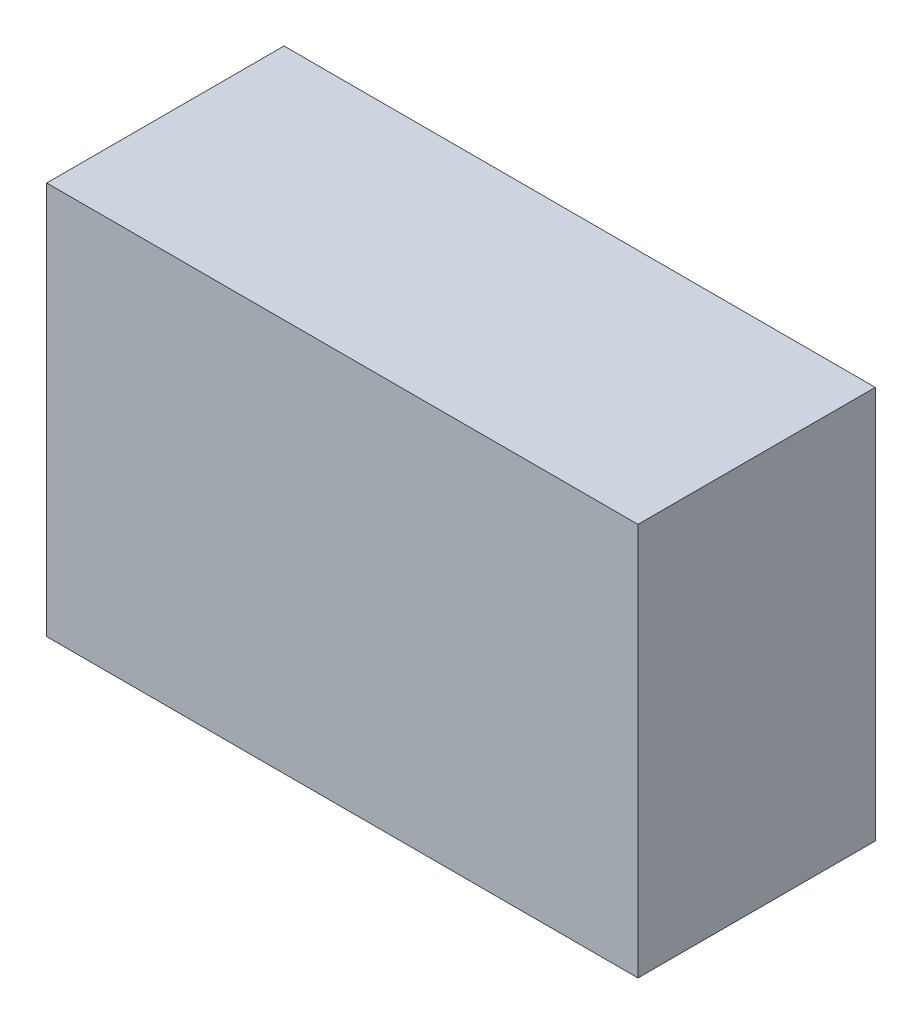
ISO-10303-21;
HEADER;
FILE_DESCRIPTION(('STEP AP214'),'2;1');
FILE_NAME('part.step','',(''),(''),'','','');
FILE_SCHEMA(('AUTOMOTIVE_DESIGN { 1 0 10303 214 1 1 1 1 }'));
ENDSEC;
DATA;
#1=APPLICATION_CONTEXT('core data for automotive mechanical design processes');
#2=APPLICATION_PROTOCOL_DEFINITION('international standard','automotive_design',2000,#1);
#3=PRODUCT_CONTEXT('',#1,'mechanical');
#4=PRODUCT('Part','Part','',(#3));
#5=PRODUCT_RELATED_PRODUCT_CATEGORY('part','',(#4));
#6=PRODUCT_DEFINITION_FORMATION('','',#4);
#7=PRODUCT_DEFINITION_CONTEXT('part definition',#1,'design');
#8=PRODUCT_DEFINITION('design','',#6,#7);
#9=PRODUCT_DEFINITION_SHAPE('','',#8);
#10=(LENGTH_UNIT() NAMED_UNIT(*) SI_UNIT(.MILLI.,.METRE.));
#11=(NAMED_UNIT(*) PLANE_ANGLE_UNIT() SI_UNIT($,.RADIAN.));
#12=(NAMED_UNIT(*) SI_UNIT($,.STERADIAN.) SOLID_ANGLE_UNIT());
#13=UNCERTAINTY_MEASURE_WITH_UNIT(LENGTH_MEASURE(1.E-05),#10,'distance_accuracy_value','');
#14=(GEOMETRIC_REPRESENTATION_CONTEXT(3) GLOBAL_UNCERTAINTY_ASSIGNED_CONTEXT((#13)) GLOBAL_UNIT_ASSIGNED_CONTEXT((#10,
#11,#12)) REPRESENTATION_CONTEXT('',''));
#15=CARTESIAN_POINT('',(0.,0.,0.));
#16=DIRECTION('',(0.,0.,1.));
#17=DIRECTION('',(1.,0.,0.));
#18=AXIS2_PLACEMENT_3D('',#15,#16,#17);
#19=CARTESIAN_POINT('',(0.,-0.337,3.05));
#20=DIRECTION('',(0.,0.,-1.));
#21=DIRECTION('',(-1.,0.,0.));
#22=AXIS2_PLACEMENT_3D('',#19,#20,#21);
#23=PLANE('',#22);
#24=DIRECTION('',(1.,0.,0.));
#25=VECTOR('',#24,1.);
#26=CARTESIAN_POINT('',(3.8,-2.862,3.05));
#27=LINE('',#26,#25);
#28=CARTESIAN_POINT('',(3.8,-2.862,3.05));
#29=VERTEX_POINT('',#28);
#30=CARTESIAN_POINT('',(-3.8,-2.862,3.05));
#31=VERTEX_POINT('',#30);
#32=EDGE_CURVE('E68',#29,#31,#27,.F.);
#33=ORIENTED_EDGE('',*,*,#32,.F.);
#34=DIRECTION('',(0.,1.,0.));
#35=VECTOR('',#34,1.);
#36=CARTESIAN_POINT('',(3.8,2.188,3.05));
#37=LINE('',#36,#35);
#38=CARTESIAN_POINT('',(3.8,2.188,3.05));
#39=VERTEX_POINT('',#38);
#40=EDGE_CURVE('E55',#39,#29,#37,.F.);
#41=ORIENTED_EDGE('',*,*,#40,.F.);
#42=DIRECTION('',(1.,0.,0.));
#43=VECTOR('',#42,1.);
#44=CARTESIAN_POINT('',(-3.8,2.188,3.05));
#45=LINE('',#44,#43);
#46=CARTESIAN_POINT('',(-3.8,2.188,3.05));
#47=VERTEX_POINT('',#46);
#48=EDGE_CURVE('E20',#47,#39,#45,.T.);
#49=ORIENTED_EDGE('',*,*,#48,.F.);
#50=DIRECTION('',(0.,1.,0.));
#51=VECTOR('',#50,1.);
#52=CARTESIAN_POINT('',(-3.8,-2.862,3.05));
#53=LINE('',#52,#51);
#54=EDGE_CURVE('E80',#31,#47,#53,.T.);
#55=ORIENTED_EDGE('',*,*,#54,.F.);
#56=EDGE_LOOP('',(#33,#41,#49,#55));
#57=FACE_BOUND('',#56,.T.);
#58=ADVANCED_FACE('F17',(#57),#23,.F.);
#59=CARTESIAN_POINT('',(-3.8,2.188,0.));
#60=DIRECTION('',(0.,1.,0.));
#61=DIRECTION('',(0.,0.,1.));
#62=AXIS2_PLACEMENT_3D('',#59,#60,#61);
#63=PLANE('',#62);
#64=DIRECTION('',(0.,0.,-1.));
#65=VECTOR('',#64,1.);
#66=CARTESIAN_POINT('',(3.8,2.188,0.));
#67=LINE('',#66,#65);
#68=CARTESIAN_POINT('',(3.8,2.188,0.));
#69=VERTEX_POINT('',#68);
#70=EDGE_CURVE('E61',#69,#39,#67,.F.);
#71=ORIENTED_EDGE('',*,*,#70,.F.);
#72=DIRECTION('',(-1.,0.,0.));
#73=VECTOR('',#72,1.);
#74=CARTESIAN_POINT('',(0.,2.188,0.));
#75=LINE('',#74,#73);
#76=CARTESIAN_POINT('',(-3.8,2.188,0.));
#77=VERTEX_POINT('',#76);
#78=EDGE_CURVE('E83',#77,#69,#75,.F.);
#79=ORIENTED_EDGE('',*,*,#78,.F.);
#80=DIRECTION('',(0.,0.,1.));
#81=VECTOR('',#80,1.);
#82=CARTESIAN_POINT('',(-3.8,2.188,0.));
#83=LINE('',#82,#81);
#84=EDGE_CURVE('E64',#47,#77,#83,.F.);
#85=ORIENTED_EDGE('',*,*,#84,.F.);
#86=ORIENTED_EDGE('',*,*,#48,.T.);
#87=EDGE_LOOP('',(#71,#79,#85,#86));
#88=FACE_BOUND('',#87,.T.);
#89=ADVANCED_FACE('F60',(#88),#63,.T.);
#90=CARTESIAN_POINT('',(3.8,2.188,0.));
#91=DIRECTION('',(1.,0.,0.));
#92=DIRECTION('',(0.,0.,-1.));
#93=AXIS2_PLACEMENT_3D('',#90,#91,#92);
#94=PLANE('',#93);
#95=DIRECTION('',(0.,0.,-1.));
#96=VECTOR('',#95,1.);
#97=CARTESIAN_POINT('',(3.8,-2.862,0.));
#98=LINE('',#97,#96);
#99=CARTESIAN_POINT('',(3.8,-2.862,0.));
#100=VERTEX_POINT('',#99);
#101=EDGE_CURVE('E70',#100,#29,#98,.F.);
#102=ORIENTED_EDGE('',*,*,#101,.F.);
#103=DIRECTION('',(0.,1.,0.));
#104=VECTOR('',#103,1.);
#105=CARTESIAN_POINT('',(3.8,-0.337,0.));
#106=LINE('',#105,#104);
#107=EDGE_CURVE('E74',#69,#100,#106,.F.);
#108=ORIENTED_EDGE('',*,*,#107,.F.);
#109=ORIENTED_EDGE('',*,*,#70,.T.);
#110=ORIENTED_EDGE('',*,*,#40,.T.);
#111=EDGE_LOOP('',(#102,#108,#109,#110));
#112=FACE_BOUND('',#111,.T.);
#113=ADVANCED_FACE('F72',(#112),#94,.T.);
#114=CARTESIAN_POINT('',(3.8,-2.862,0.));
#115=DIRECTION('',(0.,-1.,0.));
#116=DIRECTION('',(0.,0.,-1.));
#117=AXIS2_PLACEMENT_3D('',#114,#115,#116);
#118=PLANE('',#117);
#119=DIRECTION('',(0.,0.,1.));
#120=VECTOR('',#119,1.);
#121=CARTESIAN_POINT('',(-3.8,-2.862,0.));
#122=LINE('',#121,#120);
#123=CARTESIAN_POINT('',(-3.8,-2.862,0.));
#124=VERTEX_POINT('',#123);
#125=EDGE_CURVE('E35',#124,#31,#122,.T.);
#126=ORIENTED_EDGE('',*,*,#125,.F.);
#127=DIRECTION('',(-1.,0.,0.));
#128=VECTOR('',#127,1.);
#129=CARTESIAN_POINT('',(0.,-2.862,0.));
#130=LINE('',#129,#128);
#131=EDGE_CURVE('E26',#100,#124,#130,.T.);
#132=ORIENTED_EDGE('',*,*,#131,.F.);
#133=ORIENTED_EDGE('',*,*,#101,.T.);
#134=ORIENTED_EDGE('',*,*,#32,.T.);
#135=EDGE_LOOP('',(#126,#132,#133,#134));
#136=FACE_BOUND('',#135,.T.);
#137=ADVANCED_FACE('F89',(#136),#118,.T.);
#138=CARTESIAN_POINT('',(-3.8,-2.862,0.));
#139=DIRECTION('',(-1.,0.,0.));
#140=DIRECTION('',(0.,0.,1.));
#141=AXIS2_PLACEMENT_3D('',#138,#139,#140);
#142=PLANE('',#141);
#143=ORIENTED_EDGE('',*,*,#84,.T.);
#144=DIRECTION('',(0.,1.,0.));
#145=VECTOR('',#144,1.);
#146=CARTESIAN_POINT('',(-3.8,-0.337,0.));
#147=LINE('',#146,#145);
#148=EDGE_CURVE('E11',#124,#77,#147,.T.);
#149=ORIENTED_EDGE('',*,*,#148,.F.);
#150=ORIENTED_EDGE('',*,*,#125,.T.);
#151=ORIENTED_EDGE('',*,*,#54,.T.);
#152=EDGE_LOOP('',(#143,#149,#150,#151));
#153=FACE_BOUND('',#152,.T.);
#154=ADVANCED_FACE('F91',(#153),#142,.T.);
#155=CARTESIAN_POINT('',(0.,-0.337,0.));
#156=DIRECTION('',(0.,0.,-1.));
#157=DIRECTION('',(-1.,0.,0.));
#158=AXIS2_PLACEMENT_3D('',#155,#156,#157);
#159=PLANE('',#158);
#160=ORIENTED_EDGE('',*,*,#131,.T.);
#161=ORIENTED_EDGE('',*,*,#148,.T.);
#162=ORIENTED_EDGE('',*,*,#78,.T.);
#163=ORIENTED_EDGE('',*,*,#107,.T.);
#164=EDGE_LOOP('',(#160,#161,#162,#163));
#165=FACE_BOUND('',#164,.T.);
#166=ADVANCED_FACE('F88',(#165),#159,.T.);
#167=CLOSED_SHELL('',(#58,#89,#113,#137,#154,#166));
#168=MANIFOLD_SOLID_BREP('B1',#167);
#169=ADVANCED_BREP_SHAPE_REPRESENTATION('',(#18,#168),#14);
#170=SHAPE_DEFINITION_REPRESENTATION(#9,#169);
ENDSEC;
END-ISO-10303-21;
